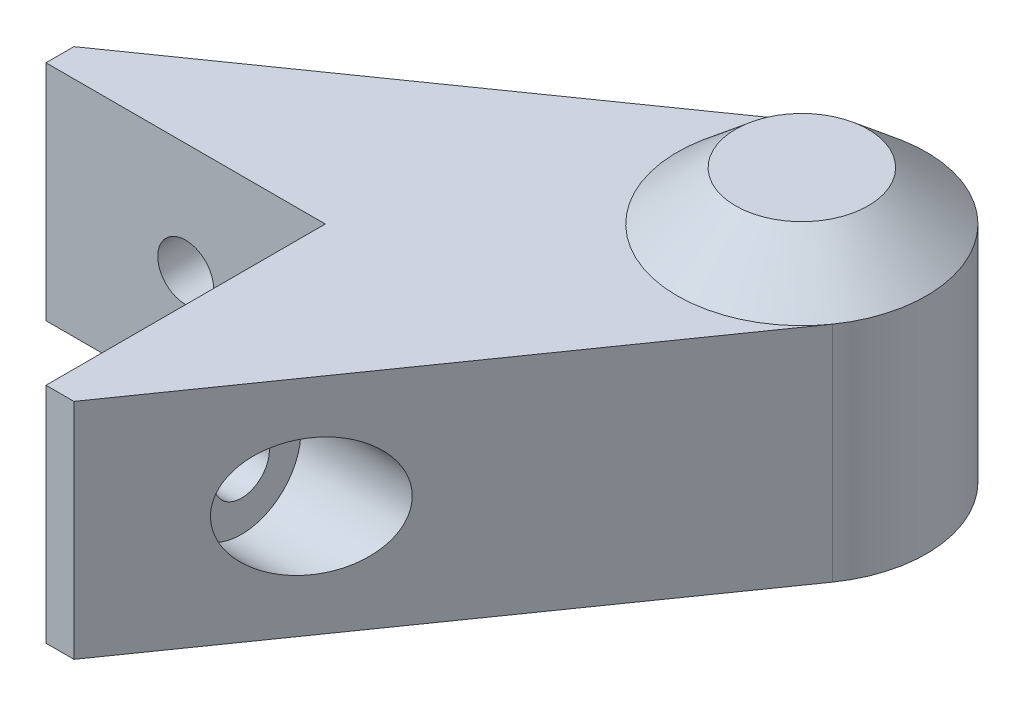
ISO-10303-21;
HEADER;
FILE_DESCRIPTION(('STEP AP214'),'2;1');
FILE_NAME('part.step','',(''),(''),'','','');
FILE_SCHEMA(('AUTOMOTIVE_DESIGN { 1 0 10303 214 1 1 1 1 }'));
ENDSEC;
DATA;
#1=APPLICATION_CONTEXT('core data for automotive mechanical design processes');
#2=APPLICATION_PROTOCOL_DEFINITION('international standard','automotive_design',2000,#1);
#3=PRODUCT_CONTEXT('',#1,'mechanical');
#4=PRODUCT('Part','Part','',(#3));
#5=PRODUCT_RELATED_PRODUCT_CATEGORY('part','',(#4));
#6=PRODUCT_DEFINITION_FORMATION('','',#4);
#7=PRODUCT_DEFINITION_CONTEXT('part definition',#1,'design');
#8=PRODUCT_DEFINITION('design','',#6,#7);
#9=PRODUCT_DEFINITION_SHAPE('','',#8);
#10=(LENGTH_UNIT() NAMED_UNIT(*) SI_UNIT(.MILLI.,.METRE.));
#11=(NAMED_UNIT(*) PLANE_ANGLE_UNIT() SI_UNIT($,.RADIAN.));
#12=(NAMED_UNIT(*) SI_UNIT($,.STERADIAN.) SOLID_ANGLE_UNIT());
#13=UNCERTAINTY_MEASURE_WITH_UNIT(LENGTH_MEASURE(1.E-05),#10,'distance_accuracy_value','');
#14=(GEOMETRIC_REPRESENTATION_CONTEXT(3) GLOBAL_UNCERTAINTY_ASSIGNED_CONTEXT((#13)) GLOBAL_UNIT_ASSIGNED_CONTEXT((#10,
#11,#12)) REPRESENTATION_CONTEXT('',''));
#15=CARTESIAN_POINT('',(0.,0.,0.));
#16=DIRECTION('',(0.,0.,1.));
#17=DIRECTION('',(1.,0.,0.));
#18=AXIS2_PLACEMENT_3D('',#15,#16,#17);
#19=CARTESIAN_POINT('',(10.,-16.,10.));
#20=DIRECTION('',(0.,0.,1.));
#21=DIRECTION('',(1.,0.,0.));
#22=AXIS2_PLACEMENT_3D('',#19,#20,#21);
#23=PLANE('',#22);
#24=DIRECTION('',(1.,0.,0.));
#25=VECTOR('',#24,1.);
#26=CARTESIAN_POINT('',(10.,0.,10.));
#27=LINE('',#26,#25);
#28=CARTESIAN_POINT('',(10.,0.,10.));
#29=VERTEX_POINT('',#28);
#30=CARTESIAN_POINT('',(12.,0.,10.));
#31=VERTEX_POINT('',#30);
#32=EDGE_CURVE('E126',#29,#31,#27,.T.);
#33=ORIENTED_EDGE('',*,*,#32,.F.);
#34=DIRECTION('',(0.,1.,0.));
#35=VECTOR('',#34,1.);
#36=CARTESIAN_POINT('',(10.,-16.,10.));
#37=LINE('',#36,#35);
#38=CARTESIAN_POINT('',(10.,-16.,10.));
#39=VERTEX_POINT('',#38);
#40=EDGE_CURVE('E42',#39,#29,#37,.T.);
#41=ORIENTED_EDGE('',*,*,#40,.F.);
#42=DIRECTION('',(1.,0.,0.));
#43=VECTOR('',#42,1.);
#44=CARTESIAN_POINT('',(10.,-16.,10.));
#45=LINE('',#44,#43);
#46=CARTESIAN_POINT('',(12.,-16.,10.));
#47=VERTEX_POINT('',#46);
#48=EDGE_CURVE('E145',#39,#47,#45,.T.);
#49=ORIENTED_EDGE('',*,*,#48,.T.);
#50=DIRECTION('',(0.,1.,0.));
#51=VECTOR('',#50,1.);
#52=CARTESIAN_POINT('',(12.,-16.,10.));
#53=LINE('',#52,#51);
#54=EDGE_CURVE('E86',#47,#31,#53,.T.);
#55=ORIENTED_EDGE('',*,*,#54,.T.);
#56=EDGE_LOOP('',(#33,#41,#49,#55));
#57=FACE_BOUND('',#56,.T.);
#58=ADVANCED_FACE('F33',(#57),#23,.T.);
#59=CARTESIAN_POINT('',(10.,-16.,-10.));
#60=DIRECTION('',(-1.,0.,0.));
#61=DIRECTION('',(0.,0.,1.));
#62=AXIS2_PLACEMENT_3D('',#59,#60,#61);
#63=PLANE('',#62);
#64=CARTESIAN_POINT('',(10.,-8.,0.));
#65=DIRECTION('',(-1.,0.,0.));
#66=DIRECTION('',(0.,0.,1.));
#67=AXIS2_PLACEMENT_3D('',#64,#65,#66);
#68=CIRCLE('',#67,2.);
#69=CARTESIAN_POINT('',(10.,-8.,2.));
#70=VERTEX_POINT('',#69);
#71=EDGE_CURVE('E162',#70,#70,#68,.T.);
#72=ORIENTED_EDGE('',*,*,#71,.F.);
#73=EDGE_LOOP('',(#72));
#74=FACE_BOUND('',#73,.T.);
#75=DIRECTION('',(0.,0.,1.));
#76=VECTOR('',#75,1.);
#77=CARTESIAN_POINT('',(10.,0.,-10.));
#78=LINE('',#77,#76);
#79=CARTESIAN_POINT('',(10.,0.,-10.));
#80=VERTEX_POINT('',#79);
#81=EDGE_CURVE('E142',#80,#29,#78,.T.);
#82=ORIENTED_EDGE('',*,*,#81,.F.);
#83=DIRECTION('',(0.,1.,0.));
#84=VECTOR('',#83,1.);
#85=CARTESIAN_POINT('',(10.,-16.,-10.));
#86=LINE('',#85,#84);
#87=CARTESIAN_POINT('',(10.,-16.,-10.));
#88=VERTEX_POINT('',#87);
#89=EDGE_CURVE('E74',#88,#80,#86,.T.);
#90=ORIENTED_EDGE('',*,*,#89,.F.);
#91=DIRECTION('',(0.,0.,1.));
#92=VECTOR('',#91,1.);
#93=CARTESIAN_POINT('',(10.,-16.,-10.));
#94=LINE('',#93,#92);
#95=EDGE_CURVE('E116',#88,#39,#94,.T.);
#96=ORIENTED_EDGE('',*,*,#95,.T.);
#97=ORIENTED_EDGE('',*,*,#40,.T.);
#98=EDGE_LOOP('',(#82,#90,#96,#97));
#99=FACE_BOUND('',#98,.T.);
#100=ADVANCED_FACE('F196',(#74,#99),#63,.T.);
#101=CARTESIAN_POINT('',(-10.,-16.,-10.));
#102=DIRECTION('',(0.,0.,1.));
#103=DIRECTION('',(1.,0.,0.));
#104=AXIS2_PLACEMENT_3D('',#101,#102,#103);
#105=PLANE('',#104);
#106=CARTESIAN_POINT('',(0.,-8.,-10.));
#107=DIRECTION('',(0.,0.,-1.));
#108=DIRECTION('',(-1.,0.,0.));
#109=AXIS2_PLACEMENT_3D('',#106,#107,#108);
#110=CIRCLE('',#109,2.);
#111=CARTESIAN_POINT('',(2.,-8.,-10.));
#112=VERTEX_POINT('',#111);
#113=EDGE_CURVE('E169',#112,#112,#110,.T.);
#114=ORIENTED_EDGE('',*,*,#113,.T.);
#115=EDGE_LOOP('',(#114));
#116=FACE_BOUND('',#115,.T.);
#117=DIRECTION('',(1.,0.,0.));
#118=VECTOR('',#117,1.);
#119=CARTESIAN_POINT('',(-10.,0.,-10.));
#120=LINE('',#119,#118);
#121=CARTESIAN_POINT('',(-10.,0.,-10.));
#122=VERTEX_POINT('',#121);
#123=EDGE_CURVE('E103',#122,#80,#120,.T.);
#124=ORIENTED_EDGE('',*,*,#123,.F.);
#125=DIRECTION('',(0.,1.,0.));
#126=VECTOR('',#125,1.);
#127=CARTESIAN_POINT('',(-10.,-16.,-10.));
#128=LINE('',#127,#126);
#129=CARTESIAN_POINT('',(-10.,-16.,-10.));
#130=VERTEX_POINT('',#129);
#131=EDGE_CURVE('E98',#130,#122,#128,.T.);
#132=ORIENTED_EDGE('',*,*,#131,.F.);
#133=DIRECTION('',(1.,0.,0.));
#134=VECTOR('',#133,1.);
#135=CARTESIAN_POINT('',(-10.,-16.,-10.));
#136=LINE('',#135,#134);
#137=EDGE_CURVE('E101',#130,#88,#136,.T.);
#138=ORIENTED_EDGE('',*,*,#137,.T.);
#139=ORIENTED_EDGE('',*,*,#89,.T.);
#140=EDGE_LOOP('',(#124,#132,#138,#139));
#141=FACE_BOUND('',#140,.T.);
#142=ADVANCED_FACE('F100',(#116,#141),#105,.T.);
#143=CARTESIAN_POINT('',(-10.,-16.,-10.));
#144=DIRECTION('',(-1.,0.,0.));
#145=DIRECTION('',(0.,0.,1.));
#146=AXIS2_PLACEMENT_3D('',#143,#144,#145);
#147=PLANE('',#146);
#148=DIRECTION('',(0.,0.,1.));
#149=VECTOR('',#148,1.);
#150=CARTESIAN_POINT('',(-10.,0.,-10.));
#151=LINE('',#150,#149);
#152=CARTESIAN_POINT('',(-10.,0.,-12.));
#153=VERTEX_POINT('',#152);
#154=EDGE_CURVE('E139',#153,#122,#151,.T.);
#155=ORIENTED_EDGE('',*,*,#154,.F.);
#156=DIRECTION('',(0.,1.,0.));
#157=VECTOR('',#156,1.);
#158=CARTESIAN_POINT('',(-10.,-16.,-12.));
#159=LINE('',#158,#157);
#160=CARTESIAN_POINT('',(-10.,-16.,-12.));
#161=VERTEX_POINT('',#160);
#162=EDGE_CURVE('E108',#161,#153,#159,.T.);
#163=ORIENTED_EDGE('',*,*,#162,.F.);
#164=DIRECTION('',(0.,0.,1.));
#165=VECTOR('',#164,1.);
#166=CARTESIAN_POINT('',(-10.,-16.,-10.));
#167=LINE('',#166,#165);
#168=EDGE_CURVE('E114',#161,#130,#167,.T.);
#169=ORIENTED_EDGE('',*,*,#168,.T.);
#170=ORIENTED_EDGE('',*,*,#131,.T.);
#171=EDGE_LOOP('',(#155,#163,#169,#170));
#172=FACE_BOUND('',#171,.T.);
#173=ADVANCED_FACE('F118',(#172),#147,.T.);
#174=CARTESIAN_POINT('',(-10.,-16.,-12.));
#175=DIRECTION('',(-0.573576436351047,0.,-0.819152044288991));
#176=DIRECTION('',(-0.819152044288991,0.,0.573576436351047));
#177=AXIS2_PLACEMENT_3D('',#174,#175,#176);
#178=PLANE('',#177);
#179=CARTESIAN_POINT('',(0.,-8.,-19.0020753820971));
#180=DIRECTION('',(-0.573576436351047,0.,-0.819152044288991));
#181=DIRECTION('',(-0.819152044288991,0.,0.573576436351047));
#182=AXIS2_PLACEMENT_3D('',#179,#180,#181);
#183=ELLIPSE('',#182,5.18829200223619,4.25);
#184=CARTESIAN_POINT('',(-4.24999999999999,-8.,-16.0261933447058));
#185=VERTEX_POINT('',#184);
#186=EDGE_CURVE('E36',#185,#185,#183,.F.);
#187=ORIENTED_EDGE('',*,*,#186,.T.);
#188=EDGE_LOOP('',(#187));
#189=FACE_BOUND('',#188,.T.);
#190=DIRECTION('',(-0.819152044288991,0.,0.573576436351047));
#191=VECTOR('',#190,1.);
#192=CARTESIAN_POINT('',(-10.,0.,-12.));
#193=LINE('',#192,#191);
#194=CARTESIAN_POINT('',(21.9469297272706,0.,-34.3694810176908));
#195=VERTEX_POINT('',#194);
#196=EDGE_CURVE('E136',#195,#153,#193,.T.);
#197=ORIENTED_EDGE('',*,*,#196,.F.);
#198=DIRECTION('',(0.,1.,0.));
#199=VECTOR('',#198,1.);
#200=CARTESIAN_POINT('',(21.9469297272706,-16.,-34.3694810176908));
#201=LINE('',#200,#199);
#202=CARTESIAN_POINT('',(21.9469297272706,-16.,-34.3694810176908));
#203=VERTEX_POINT('',#202);
#204=EDGE_CURVE('E149',#203,#195,#201,.T.);
#205=ORIENTED_EDGE('',*,*,#204,.F.);
#206=DIRECTION('',(-0.819152044288991,0.,0.573576436351047));
#207=VECTOR('',#206,1.);
#208=CARTESIAN_POINT('',(-10.,-16.,-12.));
#209=LINE('',#208,#207);
#210=EDGE_CURVE('E119',#203,#161,#209,.T.);
#211=ORIENTED_EDGE('',*,*,#210,.T.);
#212=ORIENTED_EDGE('',*,*,#162,.T.);
#213=EDGE_LOOP('',(#197,#205,#211,#212));
#214=FACE_BOUND('',#213,.T.);
#215=ADVANCED_FACE('F212',(#189,#214),#178,.T.);
#216=CARTESIAN_POINT('',(27.0629898916128,-16.,-27.0629898916128));
#217=DIRECTION('',(0.,1.,0.));
#218=DIRECTION('',(0.,0.,1.));
#219=AXIS2_PLACEMENT_3D('',#216,#217,#218);
#220=CYLINDRICAL_SURFACE('',#219,8.91957869972712);
#221=CARTESIAN_POINT('',(27.0629898916128,0.,-27.0629898916128));
#222=DIRECTION('',(0.,1.,0.));
#223=DIRECTION('',(0.,0.,-1.));
#224=AXIS2_PLACEMENT_3D('',#221,#222,#223);
#225=CIRCLE('',#224,8.91957869972712);
#226=CARTESIAN_POINT('',(34.3694810176908,0.,-21.9469297272706));
#227=VERTEX_POINT('',#226);
#228=EDGE_CURVE('E133',#227,#195,#225,.T.);
#229=ORIENTED_EDGE('',*,*,#228,.F.);
#230=DIRECTION('',(0.,1.,0.));
#231=VECTOR('',#230,1.);
#232=CARTESIAN_POINT('',(34.3694810176908,-16.,-21.9469297272706));
#233=LINE('',#232,#231);
#234=CARTESIAN_POINT('',(34.3694810176908,-16.,-21.9469297272706));
#235=VERTEX_POINT('',#234);
#236=EDGE_CURVE('E152',#235,#227,#233,.T.);
#237=ORIENTED_EDGE('',*,*,#236,.F.);
#238=CARTESIAN_POINT('',(27.0629898916128,-16.,-27.0629898916128));
#239=DIRECTION('',(0.,1.,0.));
#240=DIRECTION('',(0.,0.,-1.));
#241=AXIS2_PLACEMENT_3D('',#238,#239,#240);
#242=CIRCLE('',#241,8.91957869972712);
#243=EDGE_CURVE('E121',#235,#203,#242,.T.);
#244=ORIENTED_EDGE('',*,*,#243,.T.);
#245=ORIENTED_EDGE('',*,*,#204,.T.);
#246=EDGE_LOOP('',(#229,#237,#244,#245));
#247=FACE_BOUND('',#246,.T.);
#248=ADVANCED_FACE('F189',(#247),#220,.T.);
#249=CARTESIAN_POINT('',(34.3694810176908,-16.,-21.9469297272706));
#250=DIRECTION('',(0.819152044288991,0.,0.573576436351047));
#251=DIRECTION('',(0.573576436351047,0.,-0.819152044288991));
#252=AXIS2_PLACEMENT_3D('',#249,#250,#251);
#253=PLANE('',#252);
#254=CARTESIAN_POINT('',(19.0020753820971,-8.,0.));
#255=DIRECTION('',(0.819152044288991,0.,0.573576436351047));
#256=DIRECTION('',(-0.573576436351047,0.,0.819152044288991));
#257=AXIS2_PLACEMENT_3D('',#254,#255,#256);
#258=ELLIPSE('',#257,5.18829200223619,4.25);
#259=CARTESIAN_POINT('',(16.0261933447058,-8.,4.25));
#260=VERTEX_POINT('',#259);
#261=EDGE_CURVE('E159',#260,#260,#258,.T.);
#262=ORIENTED_EDGE('',*,*,#261,.F.);
#263=EDGE_LOOP('',(#262));
#264=FACE_BOUND('',#263,.T.);
#265=DIRECTION('',(0.573576436351047,0.,-0.819152044288991));
#266=VECTOR('',#265,1.);
#267=CARTESIAN_POINT('',(34.3694810176908,0.,-21.9469297272706));
#268=LINE('',#267,#266);
#269=EDGE_CURVE('E129',#31,#227,#268,.T.);
#270=ORIENTED_EDGE('',*,*,#269,.F.);
#271=ORIENTED_EDGE('',*,*,#54,.F.);
#272=DIRECTION('',(0.573576436351047,0.,-0.819152044288991));
#273=VECTOR('',#272,1.);
#274=CARTESIAN_POINT('',(34.3694810176908,-16.,-21.9469297272706));
#275=LINE('',#274,#273);
#276=EDGE_CURVE('E184',#47,#235,#275,.T.);
#277=ORIENTED_EDGE('',*,*,#276,.T.);
#278=ORIENTED_EDGE('',*,*,#236,.T.);
#279=EDGE_LOOP('',(#270,#271,#277,#278));
#280=FACE_BOUND('',#279,.T.);
#281=ADVANCED_FACE('F191',(#264,#280),#253,.T.);
#282=CARTESIAN_POINT('',(27.0629898916128,-16.,-27.0629898916128));
#283=DIRECTION('',(0.,-1.,0.));
#284=DIRECTION('',(0.,0.,-1.));
#285=AXIS2_PLACEMENT_3D('',#282,#283,#284);
#286=PLANE('',#285);
#287=ORIENTED_EDGE('',*,*,#48,.F.);
#288=ORIENTED_EDGE('',*,*,#95,.F.);
#289=ORIENTED_EDGE('',*,*,#137,.F.);
#290=ORIENTED_EDGE('',*,*,#168,.F.);
#291=ORIENTED_EDGE('',*,*,#210,.F.);
#292=ORIENTED_EDGE('',*,*,#243,.F.);
#293=ORIENTED_EDGE('',*,*,#276,.F.);
#294=EDGE_LOOP('',(#287,#288,#289,#290,#291,#292,#293));
#295=FACE_BOUND('',#294,.T.);
#296=ADVANCED_FACE('F112',(#295),#286,.T.);
#297=CARTESIAN_POINT('',(27.0629898916128,0.,-27.0629898916128));
#298=DIRECTION('',(0.,-1.,0.));
#299=DIRECTION('',(0.,0.,-1.));
#300=AXIS2_PLACEMENT_3D('',#297,#298,#299);
#301=PLANE('',#300);
#302=CARTESIAN_POINT('',(27.0629898916128,0.,-27.0629898916128));
#303=DIRECTION('',(0.,1.,0.));
#304=DIRECTION('',(0.,0.,1.));
#305=AXIS2_PLACEMENT_3D('',#302,#303,#304);
#306=CIRCLE('',#305,8.91957869972711);
#307=EDGE_CURVE('E11',#195,#227,#306,.T.);
#308=ORIENTED_EDGE('',*,*,#307,.F.);
#309=ORIENTED_EDGE('',*,*,#196,.T.);
#310=ORIENTED_EDGE('',*,*,#154,.T.);
#311=ORIENTED_EDGE('',*,*,#123,.T.);
#312=ORIENTED_EDGE('',*,*,#81,.T.);
#313=ORIENTED_EDGE('',*,*,#32,.T.);
#314=ORIENTED_EDGE('',*,*,#269,.T.);
#315=EDGE_LOOP('',(#308,#309,#310,#311,#312,#313,#314));
#316=FACE_BOUND('',#315,.T.);
#317=ADVANCED_FACE('F195',(#316),#301,.F.);
#318=CARTESIAN_POINT('',(27.0629898916128,0.,-27.0629898916128));
#319=DIRECTION('',(0.,-1.,0.));
#320=DIRECTION('',(0.,0.,1.));
#321=AXIS2_PLACEMENT_3D('',#318,#319,#320);
#322=CONICAL_SURFACE('',#321,8.91957869972711,0.872664625997166);
#323=CARTESIAN_POINT('',(27.0629898916128,3.5,-27.0629898916128));
#324=DIRECTION('',(0.,1.,0.));
#325=DIRECTION('',(0.,0.,1.));
#326=AXIS2_PLACEMENT_3D('',#323,#324,#325);
#327=CIRCLE('',#326,4.74844112564737);
#328=CARTESIAN_POINT('',(27.0629898916128,3.5,-22.3145487659655));
#329=VERTEX_POINT('',#328);
#330=EDGE_CURVE('E130',#329,#329,#327,.T.);
#331=ORIENTED_EDGE('',*,*,#330,.F.);
#332=EDGE_LOOP('',(#331));
#333=FACE_BOUND('',#332,.T.);
#334=ORIENTED_EDGE('',*,*,#228,.T.);
#335=ORIENTED_EDGE('',*,*,#307,.T.);
#336=EDGE_LOOP('',(#334,#335));
#337=FACE_BOUND('',#336,.T.);
#338=ADVANCED_FACE('F193',(#333,#337),#322,.T.);
#339=CARTESIAN_POINT('',(27.0629898916128,3.5,-27.0629898916128));
#340=DIRECTION('',(0.,1.,0.));
#341=DIRECTION('',(0.,0.,1.));
#342=AXIS2_PLACEMENT_3D('',#339,#340,#341);
#343=PLANE('',#342);
#344=ORIENTED_EDGE('',*,*,#330,.T.);
#345=EDGE_LOOP('',(#344));
#346=FACE_BOUND('',#345,.T.);
#347=ADVANCED_FACE('F240',(#346),#343,.T.);
#348=CARTESIAN_POINT('',(35.9825685913399,-8.,0.));
#349=DIRECTION('',(-1.,0.,0.));
#350=DIRECTION('',(0.,0.,1.));
#351=AXIS2_PLACEMENT_3D('',#348,#349,#350);
#352=CYLINDRICAL_SURFACE('',#351,2.);
#353=CARTESIAN_POINT('',(14.,-8.,0.));
#354=DIRECTION('',(-1.,0.,0.));
#355=DIRECTION('',(0.,0.,1.));
#356=AXIS2_PLACEMENT_3D('',#353,#354,#355);
#357=CIRCLE('',#356,2.);
#358=CARTESIAN_POINT('',(14.,-8.,2.));
#359=VERTEX_POINT('',#358);
#360=EDGE_CURVE('E156',#359,#359,#357,.F.);
#361=ORIENTED_EDGE('',*,*,#360,.T.);
#362=EDGE_LOOP('',(#361));
#363=FACE_BOUND('',#362,.T.);
#364=ORIENTED_EDGE('',*,*,#71,.T.);
#365=EDGE_LOOP('',(#364));
#366=FACE_BOUND('',#365,.T.);
#367=ADVANCED_FACE('F234',(#363,#366),#352,.F.);
#368=CARTESIAN_POINT('',(14.,-8.,0.));
#369=DIRECTION('',(-1.,0.,0.));
#370=DIRECTION('',(0.,0.,1.));
#371=AXIS2_PLACEMENT_3D('',#368,#369,#370);
#372=PLANE('',#371);
#373=CARTESIAN_POINT('',(14.,-8.,0.));
#374=DIRECTION('',(-1.,0.,0.));
#375=DIRECTION('',(0.,0.,1.));
#376=AXIS2_PLACEMENT_3D('',#373,#374,#375);
#377=CIRCLE('',#376,4.25);
#378=CARTESIAN_POINT('',(14.,-8.,4.25));
#379=VERTEX_POINT('',#378);
#380=EDGE_CURVE('E160',#379,#379,#377,.T.);
#381=ORIENTED_EDGE('',*,*,#380,.F.);
#382=EDGE_LOOP('',(#381));
#383=FACE_BOUND('',#382,.T.);
#384=ORIENTED_EDGE('',*,*,#360,.F.);
#385=EDGE_LOOP('',(#384));
#386=FACE_BOUND('',#385,.T.);
#387=ADVANCED_FACE('F228',(#383,#386),#372,.F.);
#388=CARTESIAN_POINT('',(35.9825685913399,-8.,0.));
#389=DIRECTION('',(-1.,0.,0.));
#390=DIRECTION('',(0.,0.,1.));
#391=AXIS2_PLACEMENT_3D('',#388,#389,#390);
#392=CYLINDRICAL_SURFACE('',#391,4.25);
#393=ORIENTED_EDGE('',*,*,#261,.T.);
#394=EDGE_LOOP('',(#393));
#395=FACE_BOUND('',#394,.T.);
#396=ORIENTED_EDGE('',*,*,#380,.T.);
#397=EDGE_LOOP('',(#396));
#398=FACE_BOUND('',#397,.T.);
#399=ADVANCED_FACE('F224',(#395,#398),#392,.F.);
#400=CARTESIAN_POINT('',(0.,-8.,-35.98256859134));
#401=DIRECTION('',(0.,0.,1.));
#402=DIRECTION('',(1.,0.,0.));
#403=AXIS2_PLACEMENT_3D('',#400,#401,#402);
#404=CYLINDRICAL_SURFACE('',#403,2.);
#405=CARTESIAN_POINT('',(0.,-8.,-14.));
#406=DIRECTION('',(0.,0.,1.));
#407=DIRECTION('',(1.,0.,0.));
#408=AXIS2_PLACEMENT_3D('',#405,#406,#407);
#409=CIRCLE('',#408,2.);
#410=CARTESIAN_POINT('',(2.,-8.,-14.));
#411=VERTEX_POINT('',#410);
#412=EDGE_CURVE('E163',#411,#411,#409,.T.);
#413=CARTESIAN_POINT('',(2.,-8.,-14.));
#414=CARTESIAN_POINT('',(2.,-8.,-13.9583333333333));
#415=CARTESIAN_POINT('',(2.,-8.,-13.9166666666667));
#416=CARTESIAN_POINT('',(2.,-8.,-13.8333333333333));
#417=CARTESIAN_POINT('',(2.,-8.,-13.7916666666667));
#418=CARTESIAN_POINT('',(2.,-8.,-13.7083333333333));
#419=CARTESIAN_POINT('',(2.,-8.,-13.6666666666667));
#420=CARTESIAN_POINT('',(2.,-8.,-13.5833333333333));
#421=CARTESIAN_POINT('',(2.,-8.,-13.5416666666667));
#422=CARTESIAN_POINT('',(2.,-8.,-13.4583333333333));
#423=CARTESIAN_POINT('',(2.,-8.,-13.4166666666667));
#424=CARTESIAN_POINT('',(2.,-8.,-13.3333333333333));
#425=CARTESIAN_POINT('',(2.,-8.,-13.2916666666667));
#426=CARTESIAN_POINT('',(2.,-8.,-13.2083333333333));
#427=CARTESIAN_POINT('',(2.,-8.,-13.1666666666667));
#428=CARTESIAN_POINT('',(2.,-8.,-13.0833333333333));
#429=CARTESIAN_POINT('',(2.,-8.,-13.0416666666667));
#430=CARTESIAN_POINT('',(2.,-8.,-12.9583333333333));
#431=CARTESIAN_POINT('',(2.,-8.,-12.9166666666667));
#432=CARTESIAN_POINT('',(2.,-8.,-12.8333333333333));
#433=CARTESIAN_POINT('',(2.,-8.,-12.7916666666667));
#434=CARTESIAN_POINT('',(2.,-8.,-12.7083333333333));
#435=CARTESIAN_POINT('',(2.,-8.,-12.6666666666667));
#436=CARTESIAN_POINT('',(2.,-8.,-12.5833333333333));
#437=CARTESIAN_POINT('',(2.,-8.,-12.5416666666667));
#438=CARTESIAN_POINT('',(2.,-8.,-12.4583333333333));
#439=CARTESIAN_POINT('',(2.,-8.,-12.4166666666667));
#440=CARTESIAN_POINT('',(2.,-8.,-12.3333333333333));
#441=CARTESIAN_POINT('',(2.,-8.,-12.2916666666667));
#442=CARTESIAN_POINT('',(2.,-8.,-12.2083333333333));
#443=CARTESIAN_POINT('',(2.,-8.,-12.1666666666667));
#444=CARTESIAN_POINT('',(2.,-8.,-12.0833333333333));
#445=CARTESIAN_POINT('',(2.,-8.,-12.0416666666667));
#446=CARTESIAN_POINT('',(2.,-8.,-11.9583333333333));
#447=CARTESIAN_POINT('',(2.,-8.,-11.9166666666667));
#448=CARTESIAN_POINT('',(2.,-8.,-11.8333333333333));
#449=CARTESIAN_POINT('',(2.,-8.,-11.7916666666667));
#450=CARTESIAN_POINT('',(2.,-8.,-11.7083333333333));
#451=CARTESIAN_POINT('',(2.,-8.,-11.6666666666667));
#452=CARTESIAN_POINT('',(2.,-8.,-11.5833333333333));
#453=CARTESIAN_POINT('',(2.,-8.,-11.5416666666667));
#454=CARTESIAN_POINT('',(2.,-8.,-11.4583333333333));
#455=CARTESIAN_POINT('',(2.,-8.,-11.4166666666667));
#456=CARTESIAN_POINT('',(2.,-8.,-11.3333333333333));
#457=CARTESIAN_POINT('',(2.,-8.,-11.2916666666667));
#458=CARTESIAN_POINT('',(2.,-8.,-11.2083333333333));
#459=CARTESIAN_POINT('',(2.,-8.,-11.1666666666667));
#460=CARTESIAN_POINT('',(2.,-8.,-11.0833333333333));
#461=CARTESIAN_POINT('',(2.,-8.,-11.0416666666667));
#462=CARTESIAN_POINT('',(2.,-8.,-10.9583333333333));
#463=CARTESIAN_POINT('',(2.,-8.,-10.9166666666667));
#464=CARTESIAN_POINT('',(2.,-8.,-10.8333333333333));
#465=CARTESIAN_POINT('',(2.,-8.,-10.7916666666667));
#466=CARTESIAN_POINT('',(2.,-8.,-10.7083333333333));
#467=CARTESIAN_POINT('',(2.,-8.,-10.6666666666667));
#468=CARTESIAN_POINT('',(2.,-8.,-10.5833333333333));
#469=CARTESIAN_POINT('',(2.,-8.,-10.5416666666667));
#470=CARTESIAN_POINT('',(2.,-8.,-10.4583333333333));
#471=CARTESIAN_POINT('',(2.,-8.,-10.4166666666667));
#472=CARTESIAN_POINT('',(2.,-8.,-10.3333333333333));
#473=CARTESIAN_POINT('',(2.,-8.,-10.2916666666667));
#474=CARTESIAN_POINT('',(2.,-8.,-10.2083333333333));
#475=CARTESIAN_POINT('',(2.,-8.,-10.1666666666667));
#476=CARTESIAN_POINT('',(2.,-8.,-10.0833333333333));
#477=CARTESIAN_POINT('',(2.,-8.,-10.0416666666667));
#478=CARTESIAN_POINT('',(2.,-8.,-10.));
#479=B_SPLINE_CURVE_WITH_KNOTS('',3,(#413,#414,#415,#416,#417,#418,#419,#420,#421,#422,#423,
#424,#425,#426,#427,#428,#429,#430,#431,#432,#433,#434,#435,#436,#437,#438,#439,#440,#441,#442,
#443,#444,#445,#446,#447,#448,#449,#450,#451,#452,#453,#454,#455,#456,#457,#458,#459,#460,#461,
#462,#463,#464,#465,#466,#467,#468,#469,#470,#471,#472,#473,#474,#475,#476,#477,#478),
.UNSPECIFIED.,.F.,.F.,(4,2,2,2,2,2,2,2,2,2,2,2,2,2,2,2,2,2,2,2,2,2,2,2,2,2,2,2,2,2,2,2,4),(0.,
0.125,0.25,0.375,0.5,0.625000000000001,0.750000000000001,0.875000000000001,1.,1.125,1.25,1.375,
1.5,1.625,1.75,1.875,2.,2.125,2.25,2.375,2.5,2.625,2.75,2.875,3.,3.125,3.25,3.375,3.5,3.625,
3.75,3.875,4.),.UNSPECIFIED.);
#480=EDGE_CURVE('BSEAM227',#411,#112,#479,.T.);
#481=ORIENTED_EDGE('',*,*,#412,.F.);
#482=ORIENTED_EDGE('',*,*,#113,.F.);
#483=ORIENTED_EDGE('',*,*,#480,.T.);
#484=ORIENTED_EDGE('',*,*,#480,.F.);
#485=EDGE_LOOP('',(#481,#483,#482,#484));
#486=FACE_BOUND('',#485,.T.);
#487=ADVANCED_FACE('F227',(#486),#404,.F.);
#488=CARTESIAN_POINT('',(0.,-8.,-35.98256859134));
#489=DIRECTION('',(0.,0.,1.));
#490=DIRECTION('',(1.,0.,0.));
#491=AXIS2_PLACEMENT_3D('',#488,#489,#490);
#492=CYLINDRICAL_SURFACE('',#491,4.25);
#493=ORIENTED_EDGE('',*,*,#186,.F.);
#494=EDGE_LOOP('',(#493));
#495=FACE_BOUND('',#494,.T.);
#496=CARTESIAN_POINT('',(0.,-8.,-14.));
#497=DIRECTION('',(0.,0.,-1.));
#498=DIRECTION('',(-1.,0.,0.));
#499=AXIS2_PLACEMENT_3D('',#496,#497,#498);
#500=CIRCLE('',#499,4.25);
#501=CARTESIAN_POINT('',(-4.24999999999999,-8.,-14.));
#502=VERTEX_POINT('',#501);
#503=EDGE_CURVE('E165',#502,#502,#500,.T.);
#504=ORIENTED_EDGE('',*,*,#503,.F.);
#505=EDGE_LOOP('',(#504));
#506=FACE_BOUND('',#505,.T.);
#507=ADVANCED_FACE('F331',(#495,#506),#492,.F.);
#508=CARTESIAN_POINT('',(0.,-8.,-14.));
#509=DIRECTION('',(0.,0.,1.));
#510=DIRECTION('',(-1.,0.,0.));
#511=AXIS2_PLACEMENT_3D('',#508,#509,#510);
#512=PLANE('',#511);
#513=ORIENTED_EDGE('',*,*,#412,.T.);
#514=EDGE_LOOP('',(#513));
#515=FACE_BOUND('',#514,.T.);
#516=ORIENTED_EDGE('',*,*,#503,.T.);
#517=EDGE_LOOP('',(#516));
#518=FACE_BOUND('',#517,.T.);
#519=ADVANCED_FACE('F338',(#515,#518),#512,.F.);
#520=CLOSED_SHELL('',(#58,#100,#142,#173,#215,#248,#281,#296,#317,#338,#347,#367,#387,#399,#487,
#507,#519));
#521=MANIFOLD_SOLID_BREP('B2',#520);
#522=ADVANCED_BREP_SHAPE_REPRESENTATION('',(#18,#521),#14);
#523=SHAPE_DEFINITION_REPRESENTATION(#9,#522);
ENDSEC;
END-ISO-10303-21;
